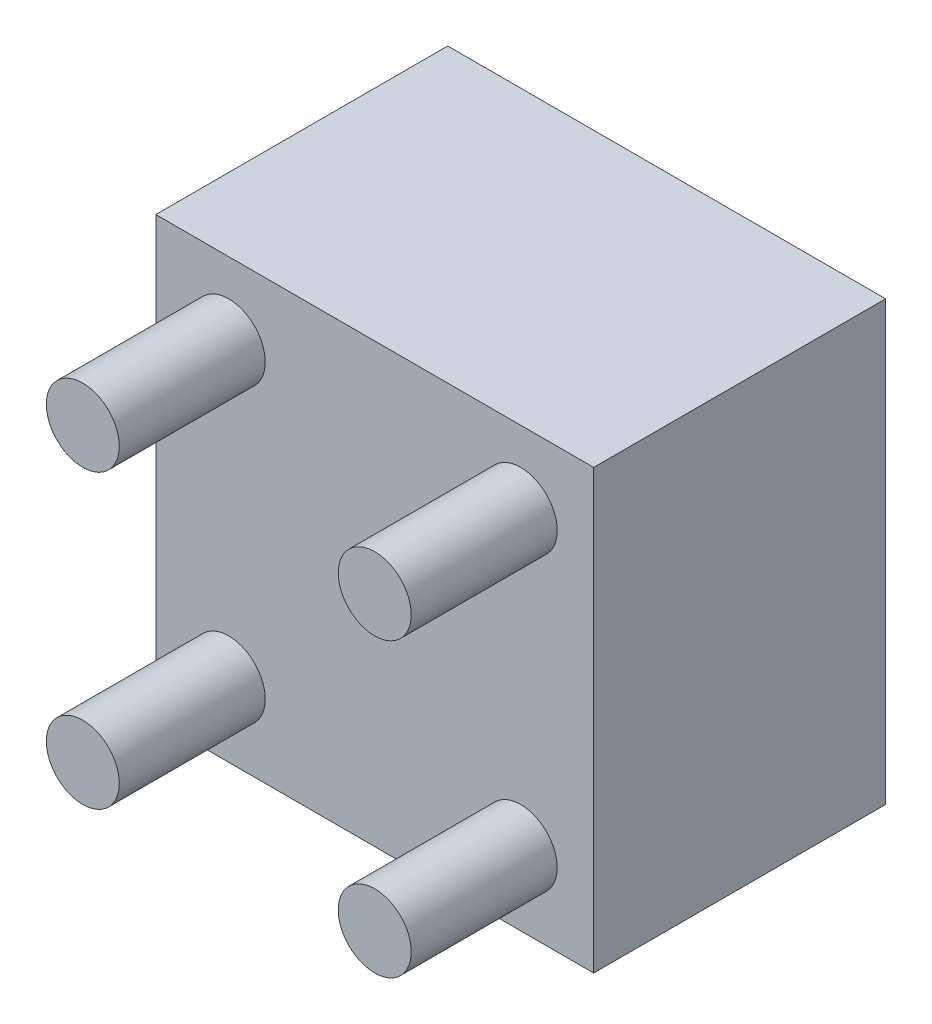
ISO-10303-21;
HEADER;
FILE_DESCRIPTION(('STEP AP214'),'2;1');
FILE_NAME('part.step','',(''),(''),'','','');
FILE_SCHEMA(('AUTOMOTIVE_DESIGN { 1 0 10303 214 1 1 1 1 }'));
ENDSEC;
DATA;
#1=APPLICATION_CONTEXT('core data for automotive mechanical design processes');
#2=APPLICATION_PROTOCOL_DEFINITION('international standard','automotive_design',2000,#1);
#3=PRODUCT_CONTEXT('',#1,'mechanical');
#4=PRODUCT('Part','Part','',(#3));
#5=PRODUCT_RELATED_PRODUCT_CATEGORY('part','',(#4));
#6=PRODUCT_DEFINITION_FORMATION('','',#4);
#7=PRODUCT_DEFINITION_CONTEXT('part definition',#1,'design');
#8=PRODUCT_DEFINITION('design','',#6,#7);
#9=PRODUCT_DEFINITION_SHAPE('','',#8);
#10=(LENGTH_UNIT() NAMED_UNIT(*) SI_UNIT(.MILLI.,.METRE.));
#11=(NAMED_UNIT(*) PLANE_ANGLE_UNIT() SI_UNIT($,.RADIAN.));
#12=(NAMED_UNIT(*) SI_UNIT($,.STERADIAN.) SOLID_ANGLE_UNIT());
#13=UNCERTAINTY_MEASURE_WITH_UNIT(LENGTH_MEASURE(1.E-05),#10,'distance_accuracy_value','');
#14=(GEOMETRIC_REPRESENTATION_CONTEXT(3) GLOBAL_UNCERTAINTY_ASSIGNED_CONTEXT((#13)) GLOBAL_UNIT_ASSIGNED_CONTEXT((#10,
#11,#12)) REPRESENTATION_CONTEXT('',''));
#15=CARTESIAN_POINT('',(0.,0.,0.));
#16=DIRECTION('',(0.,0.,1.));
#17=DIRECTION('',(1.,0.,0.));
#18=AXIS2_PLACEMENT_3D('',#15,#16,#17);
#19=CARTESIAN_POINT('',(-30.814479638009,18.5972850678733,40.));
#20=DIRECTION('',(1.,0.,0.));
#21=DIRECTION('',(0.,0.,-1.));
#22=AXIS2_PLACEMENT_3D('',#19,#20,#21);
#23=PLANE('',#22);
#24=DIRECTION('',(0.,-1.,0.));
#25=VECTOR('',#24,1.);
#26=CARTESIAN_POINT('',(-30.814479638009,18.5972850678733,0.));
#27=LINE('',#26,#25);
#28=CARTESIAN_POINT('',(-30.814479638009,18.5972850678733,0.));
#29=VERTEX_POINT('',#28);
#30=CARTESIAN_POINT('',(-30.814479638009,-41.4027149321267,0.));
#31=VERTEX_POINT('',#30);
#32=EDGE_CURVE('E100',#29,#31,#27,.T.);
#33=ORIENTED_EDGE('',*,*,#32,.T.);
#34=DIRECTION('',(0.,0.,-1.));
#35=VECTOR('',#34,1.);
#36=CARTESIAN_POINT('',(-30.814479638009,-41.4027149321267,40.));
#37=LINE('',#36,#35);
#38=CARTESIAN_POINT('',(-30.814479638009,-41.4027149321267,40.));
#39=VERTEX_POINT('',#38);
#40=EDGE_CURVE('E91',#39,#31,#37,.T.);
#41=ORIENTED_EDGE('',*,*,#40,.F.);
#42=DIRECTION('',(0.,-1.,0.));
#43=VECTOR('',#42,1.);
#44=CARTESIAN_POINT('',(-30.814479638009,18.5972850678733,40.));
#45=LINE('',#44,#43);
#46=CARTESIAN_POINT('',(-30.814479638009,18.5972850678733,40.));
#47=VERTEX_POINT('',#46);
#48=EDGE_CURVE('E85',#47,#39,#45,.T.);
#49=ORIENTED_EDGE('',*,*,#48,.F.);
#50=DIRECTION('',(0.,0.,-1.));
#51=VECTOR('',#50,1.);
#52=CARTESIAN_POINT('',(-30.814479638009,18.5972850678733,40.));
#53=LINE('',#52,#51);
#54=EDGE_CURVE('E96',#47,#29,#53,.T.);
#55=ORIENTED_EDGE('',*,*,#54,.T.);
#56=EDGE_LOOP('',(#33,#41,#49,#55));
#57=FACE_BOUND('',#56,.T.);
#58=ADVANCED_FACE('F33',(#57),#23,.F.);
#59=CARTESIAN_POINT('',(-30.814479638009,-41.4027149321267,40.));
#60=DIRECTION('',(0.,1.,0.));
#61=DIRECTION('',(0.,0.,1.));
#62=AXIS2_PLACEMENT_3D('',#59,#60,#61);
#63=PLANE('',#62);
#64=DIRECTION('',(1.,0.,0.));
#65=VECTOR('',#64,1.);
#66=CARTESIAN_POINT('',(-30.814479638009,-41.4027149321267,0.));
#67=LINE('',#66,#65);
#68=CARTESIAN_POINT('',(29.185520361991,-41.4027149321267,0.));
#69=VERTEX_POINT('',#68);
#70=EDGE_CURVE('E90',#31,#69,#67,.T.);
#71=ORIENTED_EDGE('',*,*,#70,.T.);
#72=DIRECTION('',(0.,0.,-1.));
#73=VECTOR('',#72,1.);
#74=CARTESIAN_POINT('',(29.185520361991,-41.4027149321267,40.));
#75=LINE('',#74,#73);
#76=CARTESIAN_POINT('',(29.185520361991,-41.4027149321267,40.));
#77=VERTEX_POINT('',#76);
#78=EDGE_CURVE('E88',#77,#69,#75,.T.);
#79=ORIENTED_EDGE('',*,*,#78,.F.);
#80=DIRECTION('',(1.,0.,0.));
#81=VECTOR('',#80,1.);
#82=CARTESIAN_POINT('',(-30.814479638009,-41.4027149321267,40.));
#83=LINE('',#82,#81);
#84=EDGE_CURVE('E80',#39,#77,#83,.T.);
#85=ORIENTED_EDGE('',*,*,#84,.F.);
#86=ORIENTED_EDGE('',*,*,#40,.T.);
#87=EDGE_LOOP('',(#71,#79,#85,#86));
#88=FACE_BOUND('',#87,.T.);
#89=ADVANCED_FACE('F89',(#88),#63,.F.);
#90=CARTESIAN_POINT('',(29.185520361991,18.5972850678733,40.));
#91=DIRECTION('',(-1.,0.,0.));
#92=DIRECTION('',(0.,0.,1.));
#93=AXIS2_PLACEMENT_3D('',#90,#91,#92);
#94=PLANE('',#93);
#95=DIRECTION('',(0.,1.,0.));
#96=VECTOR('',#95,1.);
#97=CARTESIAN_POINT('',(29.185520361991,18.5972850678733,0.));
#98=LINE('',#97,#96);
#99=CARTESIAN_POINT('',(29.185520361991,18.5972850678733,0.));
#100=VERTEX_POINT('',#99);
#101=EDGE_CURVE('E66',#69,#100,#98,.T.);
#102=ORIENTED_EDGE('',*,*,#101,.T.);
#103=DIRECTION('',(0.,0.,-1.));
#104=VECTOR('',#103,1.);
#105=CARTESIAN_POINT('',(29.185520361991,18.5972850678733,40.));
#106=LINE('',#105,#104);
#107=CARTESIAN_POINT('',(29.185520361991,18.5972850678733,40.));
#108=VERTEX_POINT('',#107);
#109=EDGE_CURVE('E92',#108,#100,#106,.T.);
#110=ORIENTED_EDGE('',*,*,#109,.F.);
#111=DIRECTION('',(0.,1.,0.));
#112=VECTOR('',#111,1.);
#113=CARTESIAN_POINT('',(29.185520361991,18.5972850678733,40.));
#114=LINE('',#113,#112);
#115=EDGE_CURVE('E83',#77,#108,#114,.T.);
#116=ORIENTED_EDGE('',*,*,#115,.F.);
#117=ORIENTED_EDGE('',*,*,#78,.T.);
#118=EDGE_LOOP('',(#102,#110,#116,#117));
#119=FACE_BOUND('',#118,.T.);
#120=ADVANCED_FACE('F94',(#119),#94,.F.);
#121=CARTESIAN_POINT('',(-30.814479638009,18.5972850678733,40.));
#122=DIRECTION('',(0.,-1.,0.));
#123=DIRECTION('',(1.,0.,0.));
#124=AXIS2_PLACEMENT_3D('',#121,#122,#123);
#125=PLANE('',#124);
#126=DIRECTION('',(-1.,0.,0.));
#127=VECTOR('',#126,1.);
#128=CARTESIAN_POINT('',(-30.814479638009,18.5972850678733,0.));
#129=LINE('',#128,#127);
#130=EDGE_CURVE('E72',#100,#29,#129,.T.);
#131=ORIENTED_EDGE('',*,*,#130,.T.);
#132=ORIENTED_EDGE('',*,*,#54,.F.);
#133=DIRECTION('',(-1.,0.,0.));
#134=VECTOR('',#133,1.);
#135=CARTESIAN_POINT('',(-30.814479638009,18.5972850678733,40.));
#136=LINE('',#135,#134);
#137=EDGE_CURVE('E49',#108,#47,#136,.T.);
#138=ORIENTED_EDGE('',*,*,#137,.F.);
#139=ORIENTED_EDGE('',*,*,#109,.T.);
#140=EDGE_LOOP('',(#131,#132,#138,#139));
#141=FACE_BOUND('',#140,.T.);
#142=ADVANCED_FACE('F116',(#141),#125,.F.);
#143=CARTESIAN_POINT('',(0.,0.,40.));
#144=DIRECTION('',(0.,0.,1.));
#145=DIRECTION('',(1.,0.,0.));
#146=AXIS2_PLACEMENT_3D('',#143,#144,#145);
#147=PLANE('',#146);
#148=CARTESIAN_POINT('',(-20.814479638009,8.5972850678733,40.));
#149=DIRECTION('',(0.,0.,1.));
#150=DIRECTION('',(1.,0.,0.));
#151=AXIS2_PLACEMENT_3D('',#148,#149,#150);
#152=CIRCLE('',#151,5.);
#153=CARTESIAN_POINT('',(-15.814479638009,8.5972850678733,40.));
#154=VERTEX_POINT('',#153);
#155=EDGE_CURVE('E148',#154,#154,#152,.T.);
#156=ORIENTED_EDGE('',*,*,#155,.F.);
#157=EDGE_LOOP('',(#156));
#158=FACE_BOUND('',#157,.T.);
#159=CARTESIAN_POINT('',(-20.814479638009,-31.4027149321267,40.));
#160=DIRECTION('',(0.,0.,1.));
#161=DIRECTION('',(1.,0.,0.));
#162=AXIS2_PLACEMENT_3D('',#159,#160,#161);
#163=CIRCLE('',#162,5.);
#164=CARTESIAN_POINT('',(-15.814479638009,-31.4027149321267,40.));
#165=VERTEX_POINT('',#164);
#166=EDGE_CURVE('E11',#165,#165,#163,.T.);
#167=ORIENTED_EDGE('',*,*,#166,.F.);
#168=EDGE_LOOP('',(#167));
#169=FACE_BOUND('',#168,.T.);
#170=CARTESIAN_POINT('',(19.185520361991,-31.4027149321267,40.));
#171=DIRECTION('',(0.,0.,1.));
#172=DIRECTION('',(1.,0.,0.));
#173=AXIS2_PLACEMENT_3D('',#170,#171,#172);
#174=CIRCLE('',#173,5.);
#175=CARTESIAN_POINT('',(24.185520361991,-31.4027149321267,40.));
#176=VERTEX_POINT('',#175);
#177=EDGE_CURVE('E139',#176,#176,#174,.T.);
#178=ORIENTED_EDGE('',*,*,#177,.F.);
#179=EDGE_LOOP('',(#178));
#180=FACE_BOUND('',#179,.T.);
#181=CARTESIAN_POINT('',(19.185520361991,8.5972850678733,40.));
#182=DIRECTION('',(0.,0.,1.));
#183=DIRECTION('',(1.,0.,0.));
#184=AXIS2_PLACEMENT_3D('',#181,#182,#183);
#185=CIRCLE('',#184,5.);
#186=CARTESIAN_POINT('',(24.185520361991,8.5972850678733,40.));
#187=VERTEX_POINT('',#186);
#188=EDGE_CURVE('E41',#187,#187,#185,.T.);
#189=ORIENTED_EDGE('',*,*,#188,.F.);
#190=EDGE_LOOP('',(#189));
#191=FACE_BOUND('',#190,.T.);
#192=ORIENTED_EDGE('',*,*,#48,.T.);
#193=ORIENTED_EDGE('',*,*,#84,.T.);
#194=ORIENTED_EDGE('',*,*,#115,.T.);
#195=ORIENTED_EDGE('',*,*,#137,.T.);
#196=EDGE_LOOP('',(#192,#193,#194,#195));
#197=FACE_BOUND('',#196,.T.);
#198=ADVANCED_FACE('F81',(#158,#169,#180,#191,#197),#147,.T.);
#199=CARTESIAN_POINT('',(0.,0.,0.));
#200=DIRECTION('',(0.,0.,1.));
#201=DIRECTION('',(1.,0.,0.));
#202=AXIS2_PLACEMENT_3D('',#199,#200,#201);
#203=PLANE('',#202);
#204=ORIENTED_EDGE('',*,*,#32,.F.);
#205=ORIENTED_EDGE('',*,*,#130,.F.);
#206=ORIENTED_EDGE('',*,*,#101,.F.);
#207=ORIENTED_EDGE('',*,*,#70,.F.);
#208=EDGE_LOOP('',(#204,#205,#206,#207));
#209=FACE_BOUND('',#208,.T.);
#210=ADVANCED_FACE('F115',(#209),#203,.F.);
#211=CARTESIAN_POINT('',(19.185520361991,8.5972850678733,60.));
#212=DIRECTION('',(0.,0.,-1.));
#213=DIRECTION('',(-1.,0.,0.));
#214=AXIS2_PLACEMENT_3D('',#211,#212,#213);
#215=CYLINDRICAL_SURFACE('',#214,5.);
#216=CARTESIAN_POINT('',(19.185520361991,8.5972850678733,60.));
#217=DIRECTION('',(0.,0.,1.));
#218=DIRECTION('',(1.,0.,0.));
#219=AXIS2_PLACEMENT_3D('',#216,#217,#218);
#220=CIRCLE('',#219,5.);
#221=CARTESIAN_POINT('',(24.185520361991,8.5972850678733,60.));
#222=VERTEX_POINT('',#221);
#223=EDGE_CURVE('E103',#222,#222,#220,.F.);
#224=ORIENTED_EDGE('',*,*,#223,.T.);
#225=EDGE_LOOP('',(#224));
#226=FACE_BOUND('',#225,.T.);
#227=ORIENTED_EDGE('',*,*,#188,.T.);
#228=EDGE_LOOP('',(#227));
#229=FACE_BOUND('',#228,.T.);
#230=ADVANCED_FACE('F112',(#226,#229),#215,.T.);
#231=CARTESIAN_POINT('',(0.,0.,60.));
#232=DIRECTION('',(0.,0.,1.));
#233=DIRECTION('',(1.,0.,0.));
#234=AXIS2_PLACEMENT_3D('',#231,#232,#233);
#235=PLANE('',#234);
#236=ORIENTED_EDGE('',*,*,#223,.F.);
#237=EDGE_LOOP('',(#236));
#238=FACE_BOUND('',#237,.T.);
#239=ADVANCED_FACE('F180',(#238),#235,.T.);
#240=CARTESIAN_POINT('',(19.185520361991,-31.4027149321267,60.));
#241=DIRECTION('',(0.,0.,-1.));
#242=DIRECTION('',(-1.,0.,0.));
#243=AXIS2_PLACEMENT_3D('',#240,#241,#242);
#244=CYLINDRICAL_SURFACE('',#243,5.);
#245=CARTESIAN_POINT('',(19.185520361991,-31.4027149321267,60.));
#246=DIRECTION('',(0.,0.,1.));
#247=DIRECTION('',(1.,0.,0.));
#248=AXIS2_PLACEMENT_3D('',#245,#246,#247);
#249=CIRCLE('',#248,5.);
#250=CARTESIAN_POINT('',(24.185520361991,-31.4027149321267,60.));
#251=VERTEX_POINT('',#250);
#252=EDGE_CURVE('E138',#251,#251,#249,.T.);
#253=ORIENTED_EDGE('',*,*,#252,.F.);
#254=EDGE_LOOP('',(#253));
#255=FACE_BOUND('',#254,.T.);
#256=ORIENTED_EDGE('',*,*,#177,.T.);
#257=EDGE_LOOP('',(#256));
#258=FACE_BOUND('',#257,.T.);
#259=ADVANCED_FACE('F176',(#255,#258),#244,.T.);
#260=CARTESIAN_POINT('',(0.,0.,60.));
#261=DIRECTION('',(0.,0.,1.));
#262=DIRECTION('',(1.,0.,0.));
#263=AXIS2_PLACEMENT_3D('',#260,#261,#262);
#264=PLANE('',#263);
#265=ORIENTED_EDGE('',*,*,#252,.T.);
#266=EDGE_LOOP('',(#265));
#267=FACE_BOUND('',#266,.T.);
#268=ADVANCED_FACE('F172',(#267),#264,.T.);
#269=CARTESIAN_POINT('',(-20.814479638009,-31.4027149321267,60.));
#270=DIRECTION('',(0.,0.,-1.));
#271=DIRECTION('',(-1.,0.,0.));
#272=AXIS2_PLACEMENT_3D('',#269,#270,#271);
#273=CYLINDRICAL_SURFACE('',#272,5.);
#274=CARTESIAN_POINT('',(-20.814479638009,-31.4027149321267,60.));
#275=DIRECTION('',(0.,0.,1.));
#276=DIRECTION('',(1.,0.,0.));
#277=AXIS2_PLACEMENT_3D('',#274,#275,#276);
#278=CIRCLE('',#277,5.);
#279=CARTESIAN_POINT('',(-15.814479638009,-31.4027149321267,60.));
#280=VERTEX_POINT('',#279);
#281=EDGE_CURVE('E142',#280,#280,#278,.F.);
#282=ORIENTED_EDGE('',*,*,#281,.T.);
#283=EDGE_LOOP('',(#282));
#284=FACE_BOUND('',#283,.T.);
#285=ORIENTED_EDGE('',*,*,#166,.T.);
#286=EDGE_LOOP('',(#285));
#287=FACE_BOUND('',#286,.T.);
#288=ADVANCED_FACE('F166',(#284,#287),#273,.T.);
#289=CARTESIAN_POINT('',(0.,0.,60.));
#290=DIRECTION('',(0.,0.,1.));
#291=DIRECTION('',(1.,0.,0.));
#292=AXIS2_PLACEMENT_3D('',#289,#290,#291);
#293=PLANE('',#292);
#294=ORIENTED_EDGE('',*,*,#281,.F.);
#295=EDGE_LOOP('',(#294));
#296=FACE_BOUND('',#295,.T.);
#297=ADVANCED_FACE('F159',(#296),#293,.T.);
#298=CARTESIAN_POINT('',(-20.814479638009,8.5972850678733,60.));
#299=DIRECTION('',(0.,0.,-1.));
#300=DIRECTION('',(-1.,0.,0.));
#301=AXIS2_PLACEMENT_3D('',#298,#299,#300);
#302=CYLINDRICAL_SURFACE('',#301,5.);
#303=CARTESIAN_POINT('',(-20.814479638009,8.5972850678733,60.));
#304=DIRECTION('',(0.,0.,1.));
#305=DIRECTION('',(1.,0.,0.));
#306=AXIS2_PLACEMENT_3D('',#303,#304,#305);
#307=CIRCLE('',#306,5.);
#308=CARTESIAN_POINT('',(-15.814479638009,8.5972850678733,60.));
#309=VERTEX_POINT('',#308);
#310=EDGE_CURVE('E147',#309,#309,#307,.T.);
#311=ORIENTED_EDGE('',*,*,#310,.F.);
#312=EDGE_LOOP('',(#311));
#313=FACE_BOUND('',#312,.T.);
#314=ORIENTED_EDGE('',*,*,#155,.T.);
#315=EDGE_LOOP('',(#314));
#316=FACE_BOUND('',#315,.T.);
#317=ADVANCED_FACE('F156',(#313,#316),#302,.T.);
#318=CARTESIAN_POINT('',(0.,0.,60.));
#319=DIRECTION('',(0.,0.,1.));
#320=DIRECTION('',(1.,0.,0.));
#321=AXIS2_PLACEMENT_3D('',#318,#319,#320);
#322=PLANE('',#321);
#323=ORIENTED_EDGE('',*,*,#310,.T.);
#324=EDGE_LOOP('',(#323));
#325=FACE_BOUND('',#324,.T.);
#326=ADVANCED_FACE('F154',(#325),#322,.T.);
#327=CLOSED_SHELL('',(#58,#89,#120,#142,#198,#210,#230,#239,#259,#268,#288,#297,#317,#326));
#328=MANIFOLD_SOLID_BREP('B2',#327);
#329=ADVANCED_BREP_SHAPE_REPRESENTATION('',(#18,#328),#14);
#330=SHAPE_DEFINITION_REPRESENTATION(#9,#329);
ENDSEC;
END-ISO-10303-21;
